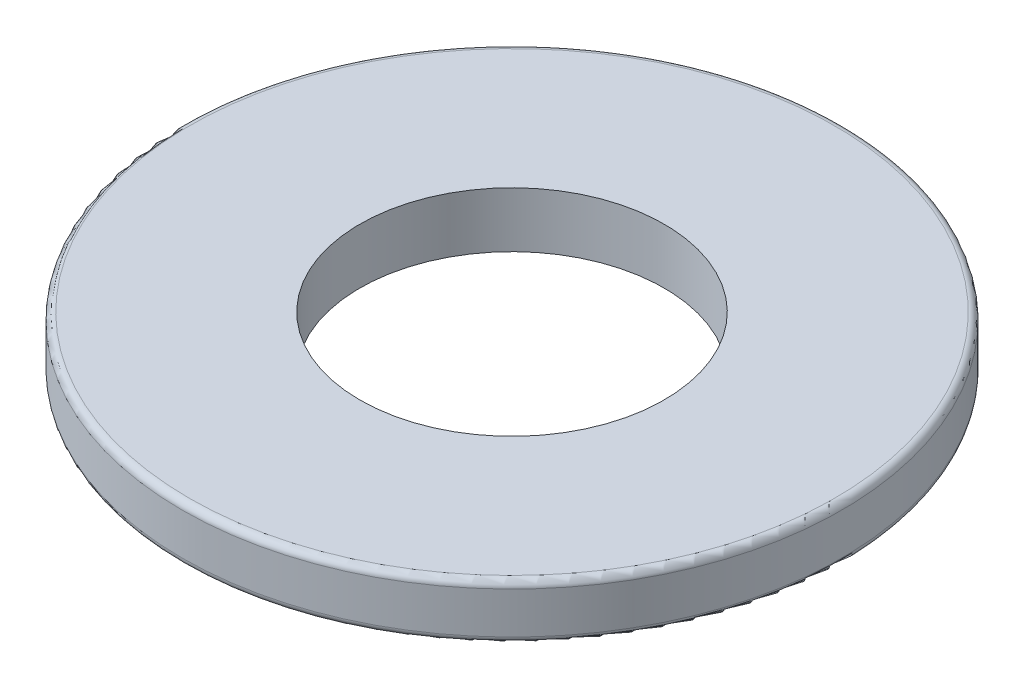
ISO-10303-21;
HEADER;
FILE_DESCRIPTION(('STEP AP214'),'2;1');
FILE_NAME('part.step','',(''),(''),'','','');
FILE_SCHEMA(('AUTOMOTIVE_DESIGN { 1 0 10303 214 1 1 1 1 }'));
ENDSEC;
DATA;
#1=APPLICATION_CONTEXT('core data for automotive mechanical design processes');
#2=APPLICATION_PROTOCOL_DEFINITION('international standard','automotive_design',2000,#1);
#3=PRODUCT_CONTEXT('',#1,'mechanical');
#4=PRODUCT('Part','Part','',(#3));
#5=PRODUCT_RELATED_PRODUCT_CATEGORY('part','',(#4));
#6=PRODUCT_DEFINITION_FORMATION('','',#4);
#7=PRODUCT_DEFINITION_CONTEXT('part definition',#1,'design');
#8=PRODUCT_DEFINITION('design','',#6,#7);
#9=PRODUCT_DEFINITION_SHAPE('','',#8);
#10=(LENGTH_UNIT() NAMED_UNIT(*) SI_UNIT(.MILLI.,.METRE.));
#11=(NAMED_UNIT(*) PLANE_ANGLE_UNIT() SI_UNIT($,.RADIAN.));
#12=(NAMED_UNIT(*) SI_UNIT($,.STERADIAN.) SOLID_ANGLE_UNIT());
#13=UNCERTAINTY_MEASURE_WITH_UNIT(LENGTH_MEASURE(1.E-05),#10,'distance_accuracy_value','');
#14=(GEOMETRIC_REPRESENTATION_CONTEXT(3) GLOBAL_UNCERTAINTY_ASSIGNED_CONTEXT((#13)) GLOBAL_UNIT_ASSIGNED_CONTEXT((#10,
#11,#12)) REPRESENTATION_CONTEXT('',''));
#15=CARTESIAN_POINT('',(0.,0.,0.));
#16=DIRECTION('',(0.,0.,1.));
#17=DIRECTION('',(1.,0.,0.));
#18=AXIS2_PLACEMENT_3D('',#15,#16,#17);
#19=CARTESIAN_POINT('',(0.,0.8,0.));
#20=DIRECTION('',(0.,1.,0.));
#21=DIRECTION('',(0.,0.,1.));
#22=AXIS2_PLACEMENT_3D('',#19,#20,#21);
#23=PLANE('',#22);
#24=CARTESIAN_POINT('',(0.,0.8,0.));
#25=DIRECTION('',(0.,1.,0.));
#26=DIRECTION('',(0.,0.,1.));
#27=AXIS2_PLACEMENT_3D('',#24,#25,#26);
#28=CIRCLE('',#27,4.6625);
#29=CARTESIAN_POINT('',(0.,0.8,4.6625));
#30=VERTEX_POINT('',#29);
#31=EDGE_CURVE('E46',#30,#30,#28,.T.);
#32=ORIENTED_EDGE('',*,*,#31,.T.);
#33=EDGE_LOOP('',(#32));
#34=FACE_BOUND('',#33,.T.);
#35=CARTESIAN_POINT('',(0.,0.8,0.));
#36=DIRECTION('',(0.,1.,0.));
#37=DIRECTION('',(0.,0.,1.));
#38=AXIS2_PLACEMENT_3D('',#35,#36,#37);
#39=CIRCLE('',#38,2.2);
#40=CARTESIAN_POINT('',(0.,0.8,2.2));
#41=VERTEX_POINT('',#40);
#42=EDGE_CURVE('E51',#41,#41,#39,.T.);
#43=ORIENTED_EDGE('',*,*,#42,.F.);
#44=EDGE_LOOP('',(#43));
#45=FACE_BOUND('',#44,.T.);
#46=ADVANCED_FACE('F31',(#34,#45),#23,.T.);
#47=CARTESIAN_POINT('',(0.,0.,0.));
#48=DIRECTION('',(0.,1.,0.));
#49=DIRECTION('',(0.,0.,1.));
#50=AXIS2_PLACEMENT_3D('',#47,#48,#49);
#51=PLANE('',#50);
#52=CARTESIAN_POINT('',(0.,0.,0.));
#53=DIRECTION('',(0.,1.,0.));
#54=DIRECTION('',(0.,0.,1.));
#55=AXIS2_PLACEMENT_3D('',#52,#53,#54);
#56=CIRCLE('',#55,4.6625);
#57=CARTESIAN_POINT('',(0.,0.,4.6625));
#58=VERTEX_POINT('',#57);
#59=EDGE_CURVE('E10',#58,#58,#56,.F.);
#60=ORIENTED_EDGE('',*,*,#59,.T.);
#61=EDGE_LOOP('',(#60));
#62=FACE_BOUND('',#61,.T.);
#63=CARTESIAN_POINT('',(0.,0.,0.));
#64=DIRECTION('',(0.,1.,0.));
#65=DIRECTION('',(0.,0.,1.));
#66=AXIS2_PLACEMENT_3D('',#63,#64,#65);
#67=CIRCLE('',#66,2.2);
#68=CARTESIAN_POINT('',(0.,0.,2.2));
#69=VERTEX_POINT('',#68);
#70=EDGE_CURVE('E52',#69,#69,#67,.T.);
#71=ORIENTED_EDGE('',*,*,#70,.T.);
#72=EDGE_LOOP('',(#71));
#73=FACE_BOUND('',#72,.T.);
#74=ADVANCED_FACE('F62',(#62,#73),#51,.F.);
#75=CARTESIAN_POINT('',(0.,0.8,0.));
#76=DIRECTION('',(0.,-1.,0.));
#77=DIRECTION('',(0.,0.,-1.));
#78=AXIS2_PLACEMENT_3D('',#75,#76,#77);
#79=CYLINDRICAL_SURFACE('',#78,4.7625);
#80=CARTESIAN_POINT('',(0.,0.7,0.));
#81=DIRECTION('',(0.,1.,0.));
#82=DIRECTION('',(0.,0.,1.));
#83=AXIS2_PLACEMENT_3D('',#80,#81,#82);
#84=CIRCLE('',#83,4.7625);
#85=CARTESIAN_POINT('',(0.,0.7,4.7625));
#86=VERTEX_POINT('',#85);
#87=EDGE_CURVE('E38',#86,#86,#84,.F.);
#88=ORIENTED_EDGE('',*,*,#87,.T.);
#89=EDGE_LOOP('',(#88));
#90=FACE_BOUND('',#89,.T.);
#91=CARTESIAN_POINT('',(0.,0.1,0.));
#92=DIRECTION('',(0.,1.,0.));
#93=DIRECTION('',(0.,0.,1.));
#94=AXIS2_PLACEMENT_3D('',#91,#92,#93);
#95=CIRCLE('',#94,4.7625);
#96=CARTESIAN_POINT('',(0.,0.1,4.7625));
#97=VERTEX_POINT('',#96);
#98=EDGE_CURVE('E42',#97,#97,#95,.T.);
#99=ORIENTED_EDGE('',*,*,#98,.T.);
#100=EDGE_LOOP('',(#99));
#101=FACE_BOUND('',#100,.T.);
#102=ADVANCED_FACE('F69',(#90,#101),#79,.T.);
#103=CARTESIAN_POINT('',(0.,0.8,0.));
#104=DIRECTION('',(0.,-1.,0.));
#105=DIRECTION('',(0.,0.,-1.));
#106=AXIS2_PLACEMENT_3D('',#103,#104,#105);
#107=CYLINDRICAL_SURFACE('',#106,2.2);
#108=ORIENTED_EDGE('',*,*,#42,.T.);
#109=EDGE_LOOP('',(#108));
#110=FACE_BOUND('',#109,.T.);
#111=ORIENTED_EDGE('',*,*,#70,.F.);
#112=EDGE_LOOP('',(#111));
#113=FACE_BOUND('',#112,.T.);
#114=ADVANCED_FACE('F58',(#110,#113),#107,.F.);
#115=CARTESIAN_POINT('',(0.,0.7,0.));
#116=DIRECTION('',(0.,1.,0.));
#117=DIRECTION('',(0.,0.,1.));
#118=AXIS2_PLACEMENT_3D('',#115,#116,#117);
#119=TOROIDAL_SURFACE('',#118,4.6625,0.1);
#120=ORIENTED_EDGE('',*,*,#87,.F.);
#121=EDGE_LOOP('',(#120));
#122=FACE_BOUND('',#121,.T.);
#123=ORIENTED_EDGE('',*,*,#31,.F.);
#124=EDGE_LOOP('',(#123));
#125=FACE_BOUND('',#124,.T.);
#126=ADVANCED_FACE('F74',(#122,#125),#119,.T.);
#127=CARTESIAN_POINT('',(0.,0.1,0.));
#128=DIRECTION('',(0.,1.,0.));
#129=DIRECTION('',(0.,0.,1.));
#130=AXIS2_PLACEMENT_3D('',#127,#128,#129);
#131=TOROIDAL_SURFACE('',#130,4.6625,0.1);
#132=ORIENTED_EDGE('',*,*,#59,.F.);
#133=EDGE_LOOP('',(#132));
#134=FACE_BOUND('',#133,.T.);
#135=ORIENTED_EDGE('',*,*,#98,.F.);
#136=EDGE_LOOP('',(#135));
#137=FACE_BOUND('',#136,.T.);
#138=ADVANCED_FACE('F33',(#134,#137),#131,.T.);
#139=CLOSED_SHELL('',(#46,#74,#102,#114,#126,#138));
#140=MANIFOLD_SOLID_BREP('B2',#139);
#141=ADVANCED_BREP_SHAPE_REPRESENTATION('',(#18,#140),#14);
#142=SHAPE_DEFINITION_REPRESENTATION(#9,#141);
ENDSEC;
END-ISO-10303-21;
